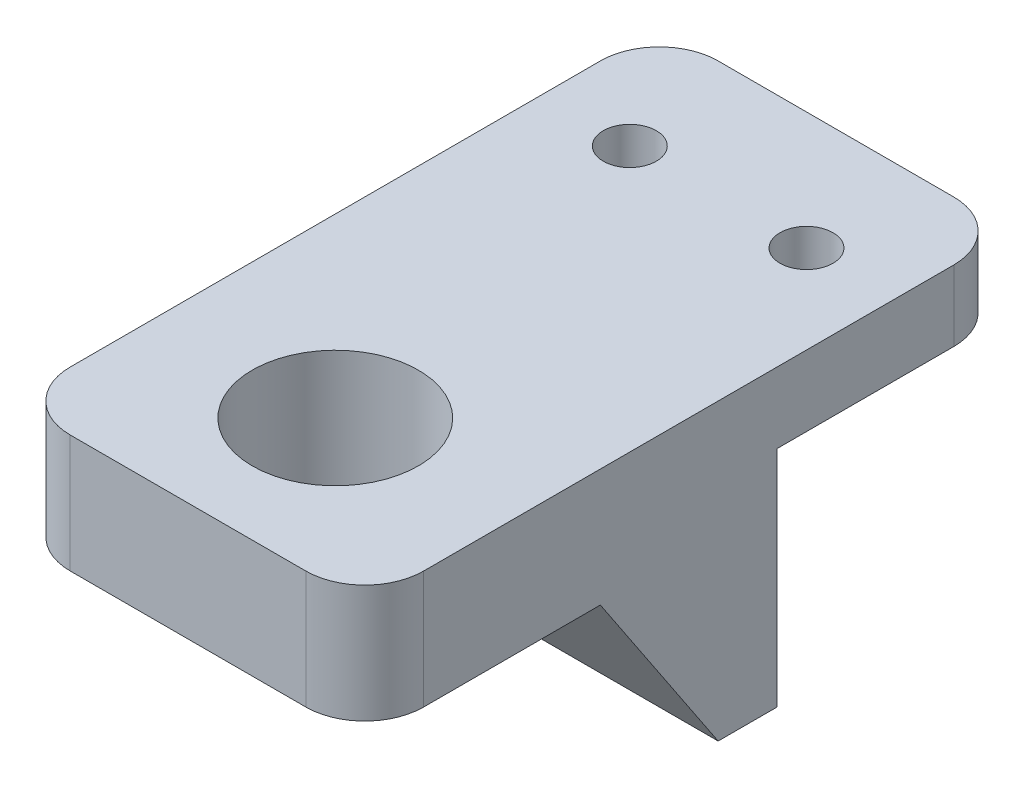
ISO-10303-21;
HEADER;
FILE_DESCRIPTION(('STEP AP214'),'2;1');
FILE_NAME('part.step','',(''),(''),'','','');
FILE_SCHEMA(('AUTOMOTIVE_DESIGN { 1 0 10303 214 1 1 1 1 }'));
ENDSEC;
DATA;
#1=APPLICATION_CONTEXT('core data for automotive mechanical design processes');
#2=APPLICATION_PROTOCOL_DEFINITION('international standard','automotive_design',2000,#1);
#3=PRODUCT_CONTEXT('',#1,'mechanical');
#4=PRODUCT('Part','Part','',(#3));
#5=PRODUCT_RELATED_PRODUCT_CATEGORY('part','',(#4));
#6=PRODUCT_DEFINITION_FORMATION('','',#4);
#7=PRODUCT_DEFINITION_CONTEXT('part definition',#1,'design');
#8=PRODUCT_DEFINITION('design','',#6,#7);
#9=PRODUCT_DEFINITION_SHAPE('','',#8);
#10=(LENGTH_UNIT() NAMED_UNIT(*) SI_UNIT(.MILLI.,.METRE.));
#11=(NAMED_UNIT(*) PLANE_ANGLE_UNIT() SI_UNIT($,.RADIAN.));
#12=(NAMED_UNIT(*) SI_UNIT($,.STERADIAN.) SOLID_ANGLE_UNIT());
#13=UNCERTAINTY_MEASURE_WITH_UNIT(LENGTH_MEASURE(1.E-05),#10,'distance_accuracy_value','');
#14=(GEOMETRIC_REPRESENTATION_CONTEXT(3) GLOBAL_UNCERTAINTY_ASSIGNED_CONTEXT((#13)) GLOBAL_UNIT_ASSIGNED_CONTEXT((#10,
#11,#12)) REPRESENTATION_CONTEXT('',''));
#15=CARTESIAN_POINT('',(0.,0.,0.));
#16=DIRECTION('',(0.,0.,1.));
#17=DIRECTION('',(1.,0.,0.));
#18=AXIS2_PLACEMENT_3D('',#15,#16,#17);
#19=CARTESIAN_POINT('',(0.,-4.,0.));
#20=DIRECTION('',(0.,1.,0.));
#21=DIRECTION('',(0.,0.,1.));
#22=AXIS2_PLACEMENT_3D('',#19,#20,#21);
#23=PLANE('',#22);
#24=CARTESIAN_POINT('',(0.,-4.,0.));
#25=DIRECTION('',(0.,1.,0.));
#26=DIRECTION('',(0.,0.,1.));
#27=AXIS2_PLACEMENT_3D('',#24,#25,#26);
#28=CIRCLE('',#27,7.05);
#29=CARTESIAN_POINT('',(0.,-4.,7.05));
#30=VERTEX_POINT('',#29);
#31=EDGE_CURVE('E153',#30,#30,#28,.T.);
#32=ORIENTED_EDGE('',*,*,#31,.T.);
#33=EDGE_LOOP('',(#32));
#34=FACE_BOUND('',#33,.T.);
#35=DIRECTION('',(0.,0.,1.));
#36=VECTOR('',#35,1.);
#37=CARTESIAN_POINT('',(15.,-4.,12.5));
#38=LINE('',#37,#36);
#39=CARTESIAN_POINT('',(15.,-4.,-7.50000000000002));
#40=VERTEX_POINT('',#39);
#41=CARTESIAN_POINT('',(15.,-4.,7.49999999999999));
#42=VERTEX_POINT('',#41);
#43=EDGE_CURVE('E170',#40,#42,#38,.T.);
#44=ORIENTED_EDGE('',*,*,#43,.T.);
#45=CARTESIAN_POINT('',(10.,-4.,7.49999999999999));
#46=DIRECTION('',(0.,1.,0.));
#47=DIRECTION('',(0.,0.,1.));
#48=AXIS2_PLACEMENT_3D('',#45,#46,#47);
#49=CIRCLE('',#48,5.);
#50=CARTESIAN_POINT('',(10.,-4.,12.5));
#51=VERTEX_POINT('',#50);
#52=EDGE_CURVE('E57',#42,#51,#49,.F.);
#53=ORIENTED_EDGE('',*,*,#52,.T.);
#54=DIRECTION('',(-1.,0.,0.));
#55=VECTOR('',#54,1.);
#56=CARTESIAN_POINT('',(-15.,-4.,12.5));
#57=LINE('',#56,#55);
#58=CARTESIAN_POINT('',(-9.99999999999999,-4.,12.5));
#59=VERTEX_POINT('',#58);
#60=EDGE_CURVE('E173',#51,#59,#57,.T.);
#61=ORIENTED_EDGE('',*,*,#60,.T.);
#62=CARTESIAN_POINT('',(-9.99999999999999,-4.,7.5));
#63=DIRECTION('',(0.,1.,0.));
#64=DIRECTION('',(0.,0.,1.));
#65=AXIS2_PLACEMENT_3D('',#62,#63,#64);
#66=CIRCLE('',#65,5.);
#67=CARTESIAN_POINT('',(-15.,-4.,7.5));
#68=VERTEX_POINT('',#67);
#69=EDGE_CURVE('E49',#59,#68,#66,.F.);
#70=ORIENTED_EDGE('',*,*,#69,.T.);
#71=DIRECTION('',(0.,0.,-1.));
#72=VECTOR('',#71,1.);
#73=CARTESIAN_POINT('',(-15.,-4.,-22.5));
#74=LINE('',#73,#72);
#75=CARTESIAN_POINT('',(-15.,-4.,-7.50000000000002));
#76=VERTEX_POINT('',#75);
#77=EDGE_CURVE('E168',#68,#76,#74,.T.);
#78=ORIENTED_EDGE('',*,*,#77,.T.);
#79=DIRECTION('',(-1.,0.,0.));
#80=VECTOR('',#79,1.);
#81=CARTESIAN_POINT('',(36.2132034355964,-4.,-7.50000000000002));
#82=LINE('',#81,#80);
#83=EDGE_CURVE('E163',#40,#76,#82,.T.);
#84=ORIENTED_EDGE('',*,*,#83,.F.);
#85=EDGE_LOOP('',(#44,#53,#61,#70,#78,#84));
#86=FACE_BOUND('',#85,.T.);
#87=ADVANCED_FACE('F34',(#34,#86),#23,.F.);
#88=CARTESIAN_POINT('',(0.,0.,0.));
#89=DIRECTION('',(0.,1.,0.));
#90=DIRECTION('',(0.,0.,1.));
#91=AXIS2_PLACEMENT_3D('',#88,#89,#90);
#92=PLANE('',#91);
#93=CARTESIAN_POINT('',(7.5,0.,-32.5));
#94=DIRECTION('',(0.,1.,0.));
#95=DIRECTION('',(0.,0.,-1.));
#96=AXIS2_PLACEMENT_3D('',#93,#94,#95);
#97=CIRCLE('',#96,2.25000000000001);
#98=CARTESIAN_POINT('',(7.5,0.,-34.75));
#99=VERTEX_POINT('',#98);
#100=EDGE_CURVE('E138',#99,#99,#97,.T.);
#101=ORIENTED_EDGE('',*,*,#100,.T.);
#102=EDGE_LOOP('',(#101));
#103=FACE_BOUND('',#102,.T.);
#104=CARTESIAN_POINT('',(-7.5,0.,-32.5));
#105=DIRECTION('',(0.,1.,0.));
#106=DIRECTION('',(0.,0.,1.));
#107=AXIS2_PLACEMENT_3D('',#104,#105,#106);
#108=CIRCLE('',#107,2.25);
#109=CARTESIAN_POINT('',(-7.5,0.,-30.25));
#110=VERTEX_POINT('',#109);
#111=EDGE_CURVE('E180',#110,#110,#108,.T.);
#112=ORIENTED_EDGE('',*,*,#111,.T.);
#113=EDGE_LOOP('',(#112));
#114=FACE_BOUND('',#113,.T.);
#115=DIRECTION('',(-1.,0.,0.));
#116=VECTOR('',#115,1.);
#117=CARTESIAN_POINT('',(15.,0.,-42.5));
#118=LINE('',#117,#116);
#119=CARTESIAN_POINT('',(10.,0.,-42.5));
#120=VERTEX_POINT('',#119);
#121=CARTESIAN_POINT('',(-10.,0.,-42.5));
#122=VERTEX_POINT('',#121);
#123=EDGE_CURVE('E192',#120,#122,#118,.T.);
#124=ORIENTED_EDGE('',*,*,#123,.F.);
#125=CARTESIAN_POINT('',(10.,0.,-37.5));
#126=DIRECTION('',(0.,1.,0.));
#127=DIRECTION('',(0.,0.,1.));
#128=AXIS2_PLACEMENT_3D('',#125,#126,#127);
#129=CIRCLE('',#128,5.);
#130=CARTESIAN_POINT('',(15.,0.,-37.5));
#131=VERTEX_POINT('',#130);
#132=EDGE_CURVE('E216',#120,#131,#129,.F.);
#133=ORIENTED_EDGE('',*,*,#132,.T.);
#134=DIRECTION('',(0.,0.,-1.));
#135=VECTOR('',#134,1.);
#136=CARTESIAN_POINT('',(15.,0.,-42.5));
#137=LINE('',#136,#135);
#138=CARTESIAN_POINT('',(15.,0.,-22.5));
#139=VERTEX_POINT('',#138);
#140=EDGE_CURVE('E203',#139,#131,#137,.T.);
#141=ORIENTED_EDGE('',*,*,#140,.F.);
#142=DIRECTION('',(1.,0.,0.));
#143=VECTOR('',#142,1.);
#144=CARTESIAN_POINT('',(15.,0.,-22.5));
#145=LINE('',#144,#143);
#146=CARTESIAN_POINT('',(-15.,0.,-22.5));
#147=VERTEX_POINT('',#146);
#148=EDGE_CURVE('E171',#147,#139,#145,.T.);
#149=ORIENTED_EDGE('',*,*,#148,.F.);
#150=DIRECTION('',(0.,0.,1.));
#151=VECTOR('',#150,1.);
#152=CARTESIAN_POINT('',(-15.,0.,-42.5));
#153=LINE('',#152,#151);
#154=CARTESIAN_POINT('',(-15.,0.,-37.5));
#155=VERTEX_POINT('',#154);
#156=EDGE_CURVE('E134',#155,#147,#153,.T.);
#157=ORIENTED_EDGE('',*,*,#156,.F.);
#158=CARTESIAN_POINT('',(-10.,0.,-37.5));
#159=DIRECTION('',(0.,1.,0.));
#160=DIRECTION('',(0.,0.,1.));
#161=AXIS2_PLACEMENT_3D('',#158,#159,#160);
#162=CIRCLE('',#161,5.);
#163=EDGE_CURVE('E214',#155,#122,#162,.F.);
#164=ORIENTED_EDGE('',*,*,#163,.T.);
#165=EDGE_LOOP('',(#124,#133,#141,#149,#157,#164));
#166=FACE_BOUND('',#165,.T.);
#167=ADVANCED_FACE('F253',(#103,#114,#166),#92,.F.);
#168=CARTESIAN_POINT('',(0.,6.,0.));
#169=DIRECTION('',(0.,1.,0.));
#170=DIRECTION('',(0.,0.,1.));
#171=AXIS2_PLACEMENT_3D('',#168,#169,#170);
#172=PLANE('',#171);
#173=CARTESIAN_POINT('',(0.,6.,0.));
#174=DIRECTION('',(0.,1.,0.));
#175=DIRECTION('',(0.,0.,1.));
#176=AXIS2_PLACEMENT_3D('',#173,#174,#175);
#177=CIRCLE('',#176,7.05);
#178=CARTESIAN_POINT('',(0.,6.,7.05));
#179=VERTEX_POINT('',#178);
#180=EDGE_CURVE('E157',#179,#179,#177,.T.);
#181=ORIENTED_EDGE('',*,*,#180,.F.);
#182=EDGE_LOOP('',(#181));
#183=FACE_BOUND('',#182,.T.);
#184=CARTESIAN_POINT('',(-7.5,6.,-32.5));
#185=DIRECTION('',(0.,1.,0.));
#186=DIRECTION('',(0.,0.,1.));
#187=AXIS2_PLACEMENT_3D('',#184,#185,#186);
#188=CIRCLE('',#187,2.25);
#189=CARTESIAN_POINT('',(-7.5,6.,-30.25));
#190=VERTEX_POINT('',#189);
#191=EDGE_CURVE('E183',#190,#190,#188,.T.);
#192=ORIENTED_EDGE('',*,*,#191,.F.);
#193=EDGE_LOOP('',(#192));
#194=FACE_BOUND('',#193,.T.);
#195=DIRECTION('',(0.,0.,-1.));
#196=VECTOR('',#195,1.);
#197=CARTESIAN_POINT('',(15.,6.,-42.5));
#198=LINE('',#197,#196);
#199=CARTESIAN_POINT('',(15.,6.,7.49999999999999));
#200=VERTEX_POINT('',#199);
#201=CARTESIAN_POINT('',(15.,6.,-37.5));
#202=VERTEX_POINT('',#201);
#203=EDGE_CURVE('E195',#200,#202,#198,.T.);
#204=ORIENTED_EDGE('',*,*,#203,.T.);
#205=CARTESIAN_POINT('',(10.,6.,-37.5));
#206=DIRECTION('',(0.,1.,0.));
#207=DIRECTION('',(0.,0.,1.));
#208=AXIS2_PLACEMENT_3D('',#205,#206,#207);
#209=CIRCLE('',#208,5.);
#210=CARTESIAN_POINT('',(10.,6.,-42.5));
#211=VERTEX_POINT('',#210);
#212=EDGE_CURVE('E229',#202,#211,#209,.T.);
#213=ORIENTED_EDGE('',*,*,#212,.T.);
#214=DIRECTION('',(-1.,0.,0.));
#215=VECTOR('',#214,1.);
#216=CARTESIAN_POINT('',(15.,6.,-42.5));
#217=LINE('',#216,#215);
#218=CARTESIAN_POINT('',(-10.,6.,-42.5));
#219=VERTEX_POINT('',#218);
#220=EDGE_CURVE('E198',#211,#219,#217,.T.);
#221=ORIENTED_EDGE('',*,*,#220,.T.);
#222=CARTESIAN_POINT('',(-10.,6.,-37.5));
#223=DIRECTION('',(0.,1.,0.));
#224=DIRECTION('',(0.,0.,1.));
#225=AXIS2_PLACEMENT_3D('',#222,#223,#224);
#226=CIRCLE('',#225,5.);
#227=CARTESIAN_POINT('',(-15.,6.,-37.5));
#228=VERTEX_POINT('',#227);
#229=EDGE_CURVE('E227',#219,#228,#226,.T.);
#230=ORIENTED_EDGE('',*,*,#229,.T.);
#231=DIRECTION('',(0.,0.,1.));
#232=VECTOR('',#231,1.);
#233=CARTESIAN_POINT('',(-15.,6.,-42.5));
#234=LINE('',#233,#232);
#235=CARTESIAN_POINT('',(-15.,6.,7.5));
#236=VERTEX_POINT('',#235);
#237=EDGE_CURVE('E188',#228,#236,#234,.T.);
#238=ORIENTED_EDGE('',*,*,#237,.T.);
#239=CARTESIAN_POINT('',(-9.99999999999999,6.,7.5));
#240=DIRECTION('',(0.,1.,0.));
#241=DIRECTION('',(0.,0.,1.));
#242=AXIS2_PLACEMENT_3D('',#239,#240,#241);
#243=CIRCLE('',#242,5.);
#244=CARTESIAN_POINT('',(-9.99999999999999,6.,12.5));
#245=VERTEX_POINT('',#244);
#246=EDGE_CURVE('E223',#236,#245,#243,.T.);
#247=ORIENTED_EDGE('',*,*,#246,.T.);
#248=DIRECTION('',(1.,0.,0.));
#249=VECTOR('',#248,1.);
#250=CARTESIAN_POINT('',(-15.,6.,12.5));
#251=LINE('',#250,#249);
#252=CARTESIAN_POINT('',(10.,6.,12.5));
#253=VERTEX_POINT('',#252);
#254=EDGE_CURVE('E191',#245,#253,#251,.T.);
#255=ORIENTED_EDGE('',*,*,#254,.T.);
#256=CARTESIAN_POINT('',(10.,6.,7.49999999999999));
#257=DIRECTION('',(0.,1.,0.));
#258=DIRECTION('',(0.,0.,1.));
#259=AXIS2_PLACEMENT_3D('',#256,#257,#258);
#260=CIRCLE('',#259,5.);
#261=EDGE_CURVE('E225',#253,#200,#260,.T.);
#262=ORIENTED_EDGE('',*,*,#261,.T.);
#263=EDGE_LOOP('',(#204,#213,#221,#230,#238,#247,#255,#262));
#264=FACE_BOUND('',#263,.T.);
#265=CARTESIAN_POINT('',(7.5,6.,-32.5));
#266=DIRECTION('',(0.,1.,0.));
#267=DIRECTION('',(0.,0.,-1.));
#268=AXIS2_PLACEMENT_3D('',#265,#266,#267);
#269=CIRCLE('',#268,2.25000000000001);
#270=CARTESIAN_POINT('',(7.5,6.,-34.75));
#271=VERTEX_POINT('',#270);
#272=EDGE_CURVE('E177',#271,#271,#269,.T.);
#273=ORIENTED_EDGE('',*,*,#272,.F.);
#274=EDGE_LOOP('',(#273));
#275=FACE_BOUND('',#274,.T.);
#276=ADVANCED_FACE('F243',(#183,#194,#264,#275),#172,.T.);
#277=CARTESIAN_POINT('',(-15.,6.,-42.5));
#278=DIRECTION('',(1.,0.,0.));
#279=DIRECTION('',(0.,0.,-1.));
#280=AXIS2_PLACEMENT_3D('',#277,#278,#279);
#281=PLANE('',#280);
#282=ORIENTED_EDGE('',*,*,#237,.F.);
#283=DIRECTION('',(0.,-1.,0.));
#284=VECTOR('',#283,1.);
#285=CARTESIAN_POINT('',(-15.,6.,-37.5));
#286=LINE('',#285,#284);
#287=EDGE_CURVE('E233',#228,#155,#286,.T.);
#288=ORIENTED_EDGE('',*,*,#287,.T.);
#289=ORIENTED_EDGE('',*,*,#156,.T.);
#290=DIRECTION('',(0.,1.,0.));
#291=VECTOR('',#290,1.);
#292=CARTESIAN_POINT('',(-15.,-4.,-22.5));
#293=LINE('',#292,#291);
#294=CARTESIAN_POINT('',(-15.,-19.,-22.5));
#295=VERTEX_POINT('',#294);
#296=EDGE_CURVE('E124',#295,#147,#293,.T.);
#297=ORIENTED_EDGE('',*,*,#296,.F.);
#298=DIRECTION('',(0.,0.,1.));
#299=VECTOR('',#298,1.);
#300=CARTESIAN_POINT('',(-15.,-19.,-22.5));
#301=LINE('',#300,#299);
#302=CARTESIAN_POINT('',(-15.,-19.,-17.5));
#303=VERTEX_POINT('',#302);
#304=EDGE_CURVE('E130',#295,#303,#301,.T.);
#305=ORIENTED_EDGE('',*,*,#304,.T.);
#306=DIRECTION('',(0.,0.832050294337844,0.554700196225229));
#307=VECTOR('',#306,1.);
#308=CARTESIAN_POINT('',(-15.,-19.,-17.5));
#309=LINE('',#308,#307);
#310=EDGE_CURVE('E149',#303,#76,#309,.T.);
#311=ORIENTED_EDGE('',*,*,#310,.T.);
#312=ORIENTED_EDGE('',*,*,#77,.F.);
#313=DIRECTION('',(0.,-1.,0.));
#314=VECTOR('',#313,1.);
#315=CARTESIAN_POINT('',(-15.,6.,7.5));
#316=LINE('',#315,#314);
#317=EDGE_CURVE('E231',#68,#236,#316,.F.);
#318=ORIENTED_EDGE('',*,*,#317,.T.);
#319=EDGE_LOOP('',(#282,#288,#289,#297,#305,#311,#312,#318));
#320=FACE_BOUND('',#319,.T.);
#321=ADVANCED_FACE('F127',(#320),#281,.F.);
#322=CARTESIAN_POINT('',(-15.,6.,12.5));
#323=DIRECTION('',(0.,0.,-1.));
#324=DIRECTION('',(-1.,0.,0.));
#325=AXIS2_PLACEMENT_3D('',#322,#323,#324);
#326=PLANE('',#325);
#327=ORIENTED_EDGE('',*,*,#60,.F.);
#328=DIRECTION('',(0.,-1.,0.));
#329=VECTOR('',#328,1.);
#330=CARTESIAN_POINT('',(10.,6.,12.5));
#331=LINE('',#330,#329);
#332=EDGE_CURVE('E11',#51,#253,#331,.F.);
#333=ORIENTED_EDGE('',*,*,#332,.T.);
#334=ORIENTED_EDGE('',*,*,#254,.F.);
#335=DIRECTION('',(0.,-1.,0.));
#336=VECTOR('',#335,1.);
#337=CARTESIAN_POINT('',(-9.99999999999999,6.,12.5));
#338=LINE('',#337,#336);
#339=EDGE_CURVE('E42',#245,#59,#338,.T.);
#340=ORIENTED_EDGE('',*,*,#339,.T.);
#341=EDGE_LOOP('',(#327,#333,#334,#340));
#342=FACE_BOUND('',#341,.T.);
#343=ADVANCED_FACE('F238',(#342),#326,.F.);
#344=CARTESIAN_POINT('',(15.,6.,-42.5));
#345=DIRECTION('',(-1.,0.,0.));
#346=DIRECTION('',(0.,0.,1.));
#347=AXIS2_PLACEMENT_3D('',#344,#345,#346);
#348=PLANE('',#347);
#349=ORIENTED_EDGE('',*,*,#140,.T.);
#350=DIRECTION('',(0.,-1.,0.));
#351=VECTOR('',#350,1.);
#352=CARTESIAN_POINT('',(15.,6.,-37.5));
#353=LINE('',#352,#351);
#354=EDGE_CURVE('E221',#131,#202,#353,.F.);
#355=ORIENTED_EDGE('',*,*,#354,.T.);
#356=ORIENTED_EDGE('',*,*,#203,.F.);
#357=DIRECTION('',(0.,-1.,0.));
#358=VECTOR('',#357,1.);
#359=CARTESIAN_POINT('',(15.,6.,7.49999999999999));
#360=LINE('',#359,#358);
#361=EDGE_CURVE('E218',#200,#42,#360,.T.);
#362=ORIENTED_EDGE('',*,*,#361,.T.);
#363=ORIENTED_EDGE('',*,*,#43,.F.);
#364=DIRECTION('',(0.,-0.832050294337844,-0.554700196225229));
#365=VECTOR('',#364,1.);
#366=CARTESIAN_POINT('',(15.,-19.,-17.5));
#367=LINE('',#366,#365);
#368=CARTESIAN_POINT('',(15.,-19.,-17.5));
#369=VERTEX_POINT('',#368);
#370=EDGE_CURVE('E160',#40,#369,#367,.T.);
#371=ORIENTED_EDGE('',*,*,#370,.T.);
#372=DIRECTION('',(0.,0.,-1.));
#373=VECTOR('',#372,1.);
#374=CARTESIAN_POINT('',(15.,-19.,-22.5));
#375=LINE('',#374,#373);
#376=CARTESIAN_POINT('',(15.,-19.,-22.5));
#377=VERTEX_POINT('',#376);
#378=EDGE_CURVE('E166',#369,#377,#375,.T.);
#379=ORIENTED_EDGE('',*,*,#378,.T.);
#380=DIRECTION('',(0.,1.,0.));
#381=VECTOR('',#380,1.);
#382=CARTESIAN_POINT('',(15.,-4.,-22.5));
#383=LINE('',#382,#381);
#384=EDGE_CURVE('E139',#377,#139,#383,.T.);
#385=ORIENTED_EDGE('',*,*,#384,.T.);
#386=EDGE_LOOP('',(#349,#355,#356,#362,#363,#371,#379,#385));
#387=FACE_BOUND('',#386,.T.);
#388=ADVANCED_FACE('F263',(#387),#348,.F.);
#389=CARTESIAN_POINT('',(15.,6.,-42.5));
#390=DIRECTION('',(0.,0.,1.));
#391=DIRECTION('',(1.,0.,0.));
#392=AXIS2_PLACEMENT_3D('',#389,#390,#391);
#393=PLANE('',#392);
#394=ORIENTED_EDGE('',*,*,#220,.F.);
#395=DIRECTION('',(0.,-1.,0.));
#396=VECTOR('',#395,1.);
#397=CARTESIAN_POINT('',(10.,6.,-42.5));
#398=LINE('',#397,#396);
#399=EDGE_CURVE('E211',#211,#120,#398,.T.);
#400=ORIENTED_EDGE('',*,*,#399,.T.);
#401=ORIENTED_EDGE('',*,*,#123,.T.);
#402=DIRECTION('',(0.,-1.,0.));
#403=VECTOR('',#402,1.);
#404=CARTESIAN_POINT('',(-10.,6.,-42.5));
#405=LINE('',#404,#403);
#406=EDGE_CURVE('E201',#122,#219,#405,.F.);
#407=ORIENTED_EDGE('',*,*,#406,.T.);
#408=EDGE_LOOP('',(#394,#400,#401,#407));
#409=FACE_BOUND('',#408,.T.);
#410=ADVANCED_FACE('F256',(#409),#393,.F.);
#411=CARTESIAN_POINT('',(-7.5,6.,-32.5));
#412=DIRECTION('',(0.,-1.,0.));
#413=DIRECTION('',(0.,0.,-1.));
#414=AXIS2_PLACEMENT_3D('',#411,#412,#413);
#415=CYLINDRICAL_SURFACE('',#414,2.25);
#416=ORIENTED_EDGE('',*,*,#191,.T.);
#417=EDGE_LOOP('',(#416));
#418=FACE_BOUND('',#417,.T.);
#419=ORIENTED_EDGE('',*,*,#111,.F.);
#420=EDGE_LOOP('',(#419));
#421=FACE_BOUND('',#420,.T.);
#422=ADVANCED_FACE('F294',(#418,#421),#415,.F.);
#423=CARTESIAN_POINT('',(7.5,6.,-32.5));
#424=DIRECTION('',(0.,-1.,0.));
#425=DIRECTION('',(0.,0.,-1.));
#426=AXIS2_PLACEMENT_3D('',#423,#424,#425);
#427=CYLINDRICAL_SURFACE('',#426,2.25000000000001);
#428=ORIENTED_EDGE('',*,*,#272,.T.);
#429=EDGE_LOOP('',(#428));
#430=FACE_BOUND('',#429,.T.);
#431=ORIENTED_EDGE('',*,*,#100,.F.);
#432=EDGE_LOOP('',(#431));
#433=FACE_BOUND('',#432,.T.);
#434=ADVANCED_FACE('F291',(#430,#433),#427,.F.);
#435=CARTESIAN_POINT('',(15.,-4.,-22.5));
#436=DIRECTION('',(0.,0.,1.));
#437=DIRECTION('',(1.,0.,0.));
#438=AXIS2_PLACEMENT_3D('',#435,#436,#437);
#439=PLANE('',#438);
#440=ORIENTED_EDGE('',*,*,#148,.T.);
#441=ORIENTED_EDGE('',*,*,#384,.F.);
#442=DIRECTION('',(-1.,0.,0.));
#443=VECTOR('',#442,1.);
#444=CARTESIAN_POINT('',(36.2132034355964,-19.,-22.5));
#445=LINE('',#444,#443);
#446=EDGE_CURVE('E142',#377,#295,#445,.T.);
#447=ORIENTED_EDGE('',*,*,#446,.T.);
#448=ORIENTED_EDGE('',*,*,#296,.T.);
#449=EDGE_LOOP('',(#440,#441,#447,#448));
#450=FACE_BOUND('',#449,.T.);
#451=ADVANCED_FACE('F143',(#450),#439,.F.);
#452=CARTESIAN_POINT('',(36.2132034355964,-19.,-17.5));
#453=DIRECTION('',(0.,-0.554700196225229,0.832050294337844));
#454=DIRECTION('',(0.,-0.832050294337844,-0.554700196225229));
#455=AXIS2_PLACEMENT_3D('',#452,#453,#454);
#456=PLANE('',#455);
#457=ORIENTED_EDGE('',*,*,#370,.F.);
#458=ORIENTED_EDGE('',*,*,#83,.T.);
#459=ORIENTED_EDGE('',*,*,#310,.F.);
#460=DIRECTION('',(-1.,0.,0.));
#461=VECTOR('',#460,1.);
#462=CARTESIAN_POINT('',(36.2132034355964,-19.,-17.5));
#463=LINE('',#462,#461);
#464=EDGE_CURVE('E148',#369,#303,#463,.T.);
#465=ORIENTED_EDGE('',*,*,#464,.F.);
#466=EDGE_LOOP('',(#457,#458,#459,#465));
#467=FACE_BOUND('',#466,.T.);
#468=ADVANCED_FACE('F268',(#467),#456,.T.);
#469=CARTESIAN_POINT('',(36.2132034355964,-19.,-22.5));
#470=DIRECTION('',(0.,-1.,0.));
#471=DIRECTION('',(0.,0.,-1.));
#472=AXIS2_PLACEMENT_3D('',#469,#470,#471);
#473=PLANE('',#472);
#474=ORIENTED_EDGE('',*,*,#378,.F.);
#475=ORIENTED_EDGE('',*,*,#464,.T.);
#476=ORIENTED_EDGE('',*,*,#304,.F.);
#477=ORIENTED_EDGE('',*,*,#446,.F.);
#478=EDGE_LOOP('',(#474,#475,#476,#477));
#479=FACE_BOUND('',#478,.T.);
#480=ADVANCED_FACE('F151',(#479),#473,.T.);
#481=CARTESIAN_POINT('',(0.,-19.,0.));
#482=DIRECTION('',(0.,1.,0.));
#483=DIRECTION('',(0.,0.,1.));
#484=AXIS2_PLACEMENT_3D('',#481,#482,#483);
#485=CYLINDRICAL_SURFACE('',#484,7.05);
#486=ORIENTED_EDGE('',*,*,#180,.T.);
#487=EDGE_LOOP('',(#486));
#488=FACE_BOUND('',#487,.T.);
#489=ORIENTED_EDGE('',*,*,#31,.F.);
#490=EDGE_LOOP('',(#489));
#491=FACE_BOUND('',#490,.T.);
#492=ADVANCED_FACE('F311',(#488,#491),#485,.F.);
#493=CARTESIAN_POINT('',(10.,6.,-37.5));
#494=DIRECTION('',(0.,-1.,0.));
#495=DIRECTION('',(0.,0.,-1.));
#496=AXIS2_PLACEMENT_3D('',#493,#494,#495);
#497=CYLINDRICAL_SURFACE('',#496,5.);
#498=ORIENTED_EDGE('',*,*,#212,.F.);
#499=ORIENTED_EDGE('',*,*,#354,.F.);
#500=ORIENTED_EDGE('',*,*,#132,.F.);
#501=ORIENTED_EDGE('',*,*,#399,.F.);
#502=EDGE_LOOP('',(#498,#499,#500,#501));
#503=FACE_BOUND('',#502,.T.);
#504=ADVANCED_FACE('F260',(#503),#497,.T.);
#505=CARTESIAN_POINT('',(-10.,6.,-37.5));
#506=DIRECTION('',(0.,-1.,0.));
#507=DIRECTION('',(0.,0.,-1.));
#508=AXIS2_PLACEMENT_3D('',#505,#506,#507);
#509=CYLINDRICAL_SURFACE('',#508,5.);
#510=ORIENTED_EDGE('',*,*,#229,.F.);
#511=ORIENTED_EDGE('',*,*,#406,.F.);
#512=ORIENTED_EDGE('',*,*,#163,.F.);
#513=ORIENTED_EDGE('',*,*,#287,.F.);
#514=EDGE_LOOP('',(#510,#511,#512,#513));
#515=FACE_BOUND('',#514,.T.);
#516=ADVANCED_FACE('F249',(#515),#509,.T.);
#517=CARTESIAN_POINT('',(10.,6.,7.49999999999999));
#518=DIRECTION('',(0.,-1.,0.));
#519=DIRECTION('',(0.,0.,-1.));
#520=AXIS2_PLACEMENT_3D('',#517,#518,#519);
#521=CYLINDRICAL_SURFACE('',#520,5.);
#522=ORIENTED_EDGE('',*,*,#261,.F.);
#523=ORIENTED_EDGE('',*,*,#332,.F.);
#524=ORIENTED_EDGE('',*,*,#52,.F.);
#525=ORIENTED_EDGE('',*,*,#361,.F.);
#526=EDGE_LOOP('',(#522,#523,#524,#525));
#527=FACE_BOUND('',#526,.T.);
#528=ADVANCED_FACE('F271',(#527),#521,.T.);
#529=CARTESIAN_POINT('',(-9.99999999999999,6.,7.5));
#530=DIRECTION('',(0.,-1.,0.));
#531=DIRECTION('',(0.,0.,-1.));
#532=AXIS2_PLACEMENT_3D('',#529,#530,#531);
#533=CYLINDRICAL_SURFACE('',#532,5.);
#534=ORIENTED_EDGE('',*,*,#246,.F.);
#535=ORIENTED_EDGE('',*,*,#317,.F.);
#536=ORIENTED_EDGE('',*,*,#69,.F.);
#537=ORIENTED_EDGE('',*,*,#339,.F.);
#538=EDGE_LOOP('',(#534,#535,#536,#537));
#539=FACE_BOUND('',#538,.T.);
#540=ADVANCED_FACE('F36',(#539),#533,.T.);
#541=CLOSED_SHELL('',(#87,#167,#276,#321,#343,#388,#410,#422,#434,#451,#468,#480,#492,#504,#516,
#528,#540));
#542=MANIFOLD_SOLID_BREP('B2',#541);
#543=ADVANCED_BREP_SHAPE_REPRESENTATION('',(#18,#542),#14);
#544=SHAPE_DEFINITION_REPRESENTATION(#9,#543);
ENDSEC;
END-ISO-10303-21;
